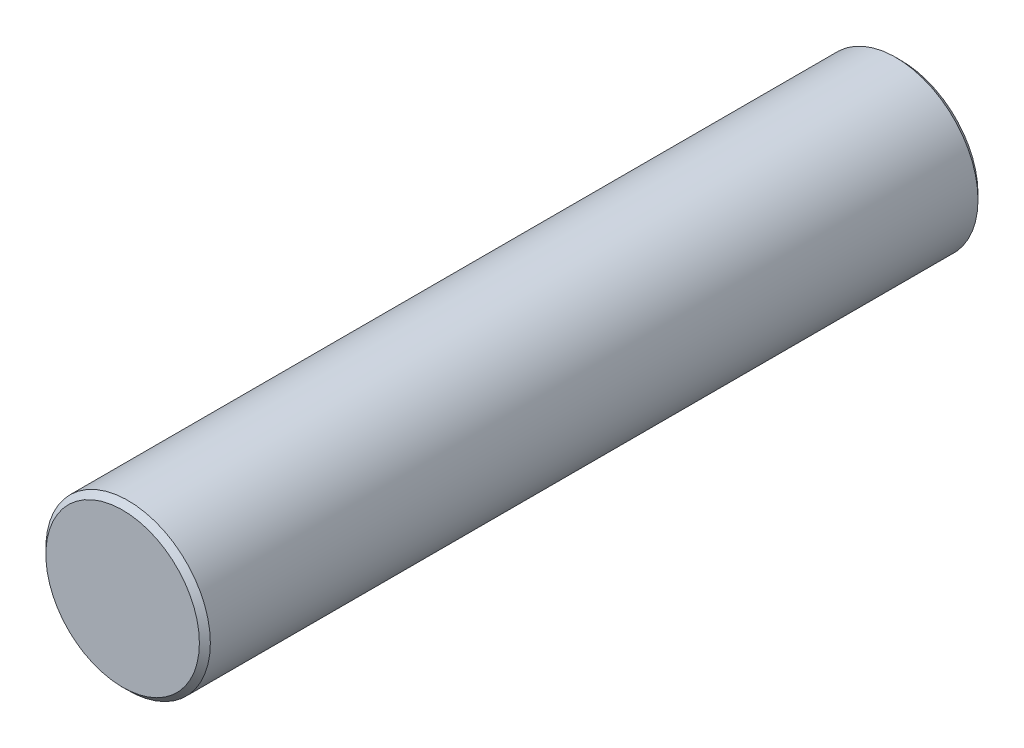
ISO-10303-21;
HEADER;
FILE_DESCRIPTION(('STEP AP214'),'2;1');
FILE_NAME('part.step','',(''),(''),'','','');
FILE_SCHEMA(('AUTOMOTIVE_DESIGN { 1 0 10303 214 1 1 1 1 }'));
ENDSEC;
DATA;
#1=APPLICATION_CONTEXT('core data for automotive mechanical design processes');
#2=APPLICATION_PROTOCOL_DEFINITION('international standard','automotive_design',2000,#1);
#3=PRODUCT_CONTEXT('',#1,'mechanical');
#4=PRODUCT('Part','Part','',(#3));
#5=PRODUCT_RELATED_PRODUCT_CATEGORY('part','',(#4));
#6=PRODUCT_DEFINITION_FORMATION('','',#4);
#7=PRODUCT_DEFINITION_CONTEXT('part definition',#1,'design');
#8=PRODUCT_DEFINITION('design','',#6,#7);
#9=PRODUCT_DEFINITION_SHAPE('','',#8);
#10=(LENGTH_UNIT() NAMED_UNIT(*) SI_UNIT(.MILLI.,.METRE.));
#11=(NAMED_UNIT(*) PLANE_ANGLE_UNIT() SI_UNIT($,.RADIAN.));
#12=(NAMED_UNIT(*) SI_UNIT($,.STERADIAN.) SOLID_ANGLE_UNIT());
#13=UNCERTAINTY_MEASURE_WITH_UNIT(LENGTH_MEASURE(1.E-05),#10,'distance_accuracy_value','');
#14=(GEOMETRIC_REPRESENTATION_CONTEXT(3) GLOBAL_UNCERTAINTY_ASSIGNED_CONTEXT((#13)) GLOBAL_UNIT_ASSIGNED_CONTEXT((#10,
#11,#12)) REPRESENTATION_CONTEXT('',''));
#15=CARTESIAN_POINT('',(0.,0.,0.));
#16=DIRECTION('',(0.,0.,1.));
#17=DIRECTION('',(1.,0.,0.));
#18=AXIS2_PLACEMENT_3D('',#15,#16,#17);
#19=CARTESIAN_POINT('',(0.,0.,14.2));
#20=DIRECTION('',(0.,0.,-1.));
#21=DIRECTION('',(-1.,0.,0.));
#22=AXIS2_PLACEMENT_3D('',#19,#20,#21);
#23=CYLINDRICAL_SURFACE('',#22,3.);
#24=CARTESIAN_POINT('',(0.,0.,-14.));
#25=DIRECTION('',(0.,0.,1.));
#26=DIRECTION('',(1.,0.,0.));
#27=AXIS2_PLACEMENT_3D('',#24,#25,#26);
#28=CIRCLE('',#27,3.);
#29=CARTESIAN_POINT('',(3.,0.,-14.));
#30=VERTEX_POINT('',#29);
#31=EDGE_CURVE('E56',#30,#30,#28,.T.);
#32=ORIENTED_EDGE('',*,*,#31,.T.);
#33=EDGE_LOOP('',(#32));
#34=FACE_BOUND('',#33,.T.);
#35=CARTESIAN_POINT('',(0.,0.,14.));
#36=DIRECTION('',(0.,0.,1.));
#37=DIRECTION('',(1.,0.,0.));
#38=AXIS2_PLACEMENT_3D('',#35,#36,#37);
#39=CIRCLE('',#38,3.);
#40=CARTESIAN_POINT('',(3.,0.,14.));
#41=VERTEX_POINT('',#40);
#42=EDGE_CURVE('E61',#41,#41,#39,.F.);
#43=ORIENTED_EDGE('',*,*,#42,.T.);
#44=EDGE_LOOP('',(#43));
#45=FACE_BOUND('',#44,.T.);
#46=ADVANCED_FACE('F44',(#34,#45),#23,.T.);
#47=CARTESIAN_POINT('',(0.,0.,14.2));
#48=DIRECTION('',(0.,0.,1.));
#49=DIRECTION('',(1.,0.,0.));
#50=AXIS2_PLACEMENT_3D('',#47,#48,#49);
#51=PLANE('',#50);
#52=CARTESIAN_POINT('',(0.,0.,14.2));
#53=DIRECTION('',(0.,0.,1.));
#54=DIRECTION('',(1.,0.,0.));
#55=AXIS2_PLACEMENT_3D('',#52,#53,#54);
#56=CIRCLE('',#55,2.8);
#57=CARTESIAN_POINT('',(2.8,0.,14.2));
#58=VERTEX_POINT('',#57);
#59=EDGE_CURVE('E10',#58,#58,#56,.T.);
#60=ORIENTED_EDGE('',*,*,#59,.T.);
#61=EDGE_LOOP('',(#60));
#62=FACE_BOUND('',#61,.T.);
#63=ADVANCED_FACE('F83',(#62),#51,.T.);
#64=CARTESIAN_POINT('',(0.,0.,-14.2));
#65=DIRECTION('',(0.,0.,1.));
#66=DIRECTION('',(1.,0.,0.));
#67=AXIS2_PLACEMENT_3D('',#64,#65,#66);
#68=PLANE('',#67);
#69=CARTESIAN_POINT('',(0.,0.,-14.2));
#70=DIRECTION('',(0.,0.,1.));
#71=DIRECTION('',(1.,0.,0.));
#72=AXIS2_PLACEMENT_3D('',#69,#70,#71);
#73=CIRCLE('',#72,2.8);
#74=CARTESIAN_POINT('',(2.8,0.,-14.2));
#75=VERTEX_POINT('',#74);
#76=EDGE_CURVE('E53',#75,#75,#73,.F.);
#77=ORIENTED_EDGE('',*,*,#76,.T.);
#78=EDGE_LOOP('',(#77));
#79=FACE_BOUND('',#78,.T.);
#80=ADVANCED_FACE('F79',(#79),#68,.F.);
#81=CARTESIAN_POINT('',(0.,0.,-14.));
#82=DIRECTION('',(0.,0.,1.));
#83=DIRECTION('',(1.,0.,0.));
#84=AXIS2_PLACEMENT_3D('',#81,#82,#83);
#85=CONICAL_SURFACE('',#84,3.,0.785398163397443);
#86=ORIENTED_EDGE('',*,*,#76,.F.);
#87=EDGE_LOOP('',(#86));
#88=FACE_BOUND('',#87,.T.);
#89=ORIENTED_EDGE('',*,*,#31,.F.);
#90=EDGE_LOOP('',(#89));
#91=FACE_BOUND('',#90,.T.);
#92=ADVANCED_FACE('F74',(#88,#91),#85,.T.);
#93=CARTESIAN_POINT('',(0.,0.,14.2));
#94=DIRECTION('',(0.,0.,-1.));
#95=DIRECTION('',(-1.,0.,0.));
#96=AXIS2_PLACEMENT_3D('',#93,#94,#95);
#97=CONICAL_SURFACE('',#96,2.8,0.785398163397444);
#98=ORIENTED_EDGE('',*,*,#42,.F.);
#99=EDGE_LOOP('',(#98));
#100=FACE_BOUND('',#99,.T.);
#101=ORIENTED_EDGE('',*,*,#59,.F.);
#102=EDGE_LOOP('',(#101));
#103=FACE_BOUND('',#102,.T.);
#104=ADVANCED_FACE('F48',(#100,#103),#97,.T.);
#105=CLOSED_SHELL('',(#46,#63,#80,#92,#104));
#106=MANIFOLD_SOLID_BREP('B2',#105);
#107=ADVANCED_BREP_SHAPE_REPRESENTATION('',(#18,#106),#14);
#108=SHAPE_DEFINITION_REPRESENTATION(#9,#107);
ENDSEC;
END-ISO-10303-21;
